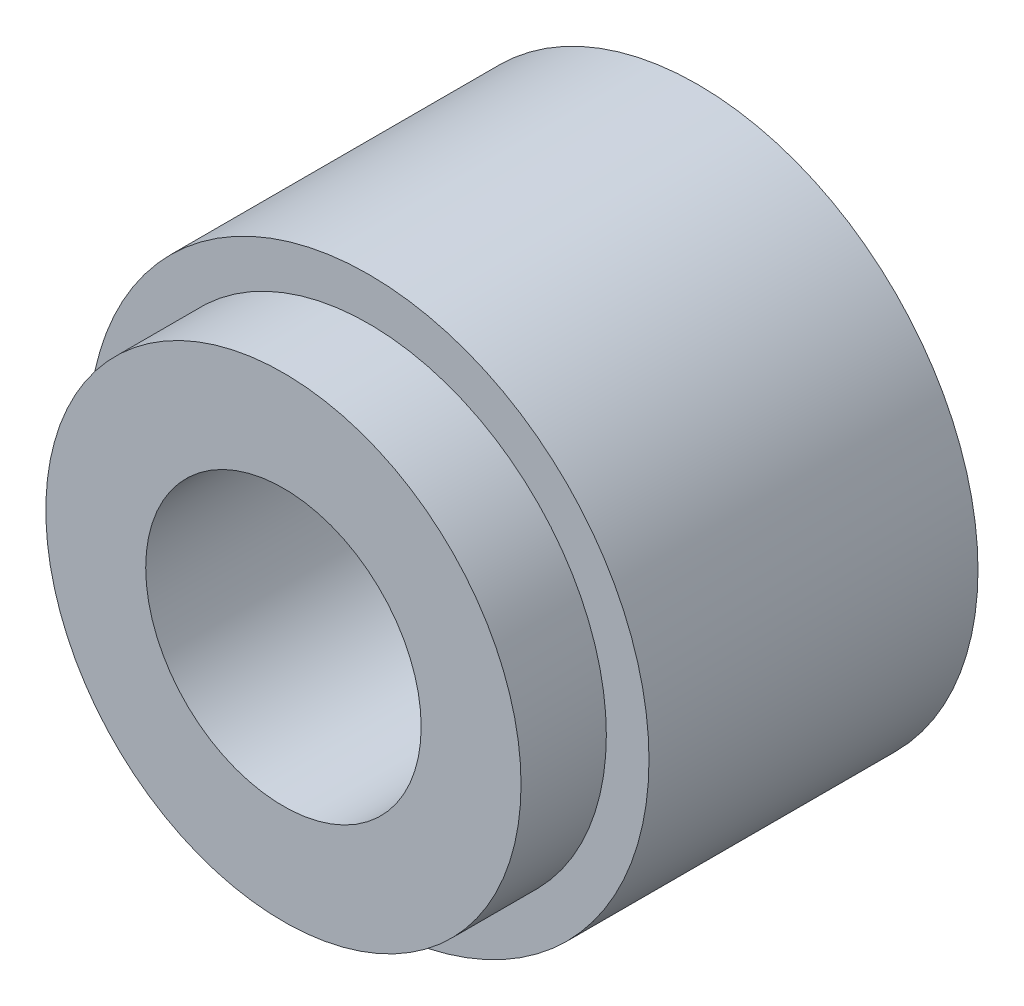
ISO-10303-21;
HEADER;
FILE_DESCRIPTION(('STEP AP214'),'2;1');
FILE_NAME('part.step','',(''),(''),'','','');
FILE_SCHEMA(('AUTOMOTIVE_DESIGN { 1 0 10303 214 1 1 1 1 }'));
ENDSEC;
DATA;
#1=APPLICATION_CONTEXT('core data for automotive mechanical design processes');
#2=APPLICATION_PROTOCOL_DEFINITION('international standard','automotive_design',2000,#1);
#3=PRODUCT_CONTEXT('',#1,'mechanical');
#4=PRODUCT('Part','Part','',(#3));
#5=PRODUCT_RELATED_PRODUCT_CATEGORY('part','',(#4));
#6=PRODUCT_DEFINITION_FORMATION('','',#4);
#7=PRODUCT_DEFINITION_CONTEXT('part definition',#1,'design');
#8=PRODUCT_DEFINITION('design','',#6,#7);
#9=PRODUCT_DEFINITION_SHAPE('','',#8);
#10=(LENGTH_UNIT() NAMED_UNIT(*) SI_UNIT(.MILLI.,.METRE.));
#11=(NAMED_UNIT(*) PLANE_ANGLE_UNIT() SI_UNIT($,.RADIAN.));
#12=(NAMED_UNIT(*) SI_UNIT($,.STERADIAN.) SOLID_ANGLE_UNIT());
#13=UNCERTAINTY_MEASURE_WITH_UNIT(LENGTH_MEASURE(1.E-05),#10,'distance_accuracy_value','');
#14=(GEOMETRIC_REPRESENTATION_CONTEXT(3) GLOBAL_UNCERTAINTY_ASSIGNED_CONTEXT((#13)) GLOBAL_UNIT_ASSIGNED_CONTEXT((#10,
#11,#12)) REPRESENTATION_CONTEXT('',''));
#15=CARTESIAN_POINT('',(0.,0.,0.));
#16=DIRECTION('',(0.,0.,1.));
#17=DIRECTION('',(1.,0.,0.));
#18=AXIS2_PLACEMENT_3D('',#15,#16,#17);
#19=CARTESIAN_POINT('',(0.,0.,2.7));
#20=DIRECTION('',(0.,0.,1.));
#21=DIRECTION('',(1.,0.,0.));
#22=AXIS2_PLACEMENT_3D('',#19,#20,#21);
#23=PLANE('',#22);
#24=CARTESIAN_POINT('',(0.,0.,2.7));
#25=DIRECTION('',(0.,0.,1.));
#26=DIRECTION('',(1.,0.,0.));
#27=AXIS2_PLACEMENT_3D('',#24,#25,#26);
#28=CIRCLE('',#27,2.3);
#29=CARTESIAN_POINT('',(-2.3,0.,2.7));
#30=VERTEX_POINT('',#29);
#31=EDGE_CURVE('E10',#30,#30,#28,.T.);
#32=ORIENTED_EDGE('',*,*,#31,.T.);
#33=EDGE_LOOP('',(#32));
#34=FACE_BOUND('',#33,.T.);
#35=CARTESIAN_POINT('',(0.,0.,2.7));
#36=DIRECTION('',(0.,0.,1.));
#37=DIRECTION('',(1.,0.,0.));
#38=AXIS2_PLACEMENT_3D('',#35,#36,#37);
#39=CIRCLE('',#38,1.95);
#40=CARTESIAN_POINT('',(1.95,0.,2.7));
#41=VERTEX_POINT('',#40);
#42=EDGE_CURVE('E45',#41,#41,#39,.T.);
#43=ORIENTED_EDGE('',*,*,#42,.F.);
#44=EDGE_LOOP('',(#43));
#45=FACE_BOUND('',#44,.T.);
#46=ADVANCED_FACE('F32',(#34,#45),#23,.T.);
#47=CARTESIAN_POINT('',(0.,0.,2.7));
#48=DIRECTION('',(0.,0.,-1.));
#49=DIRECTION('',(-1.,0.,0.));
#50=AXIS2_PLACEMENT_3D('',#47,#48,#49);
#51=CYLINDRICAL_SURFACE('',#50,2.3);
#52=CARTESIAN_POINT('',(0.,0.,0.));
#53=DIRECTION('',(0.,0.,1.));
#54=DIRECTION('',(1.,0.,0.));
#55=AXIS2_PLACEMENT_3D('',#52,#53,#54);
#56=CIRCLE('',#55,2.3);
#57=CARTESIAN_POINT('',(-2.3,0.,0.));
#58=VERTEX_POINT('',#57);
#59=EDGE_CURVE('E36',#58,#58,#56,.T.);
#60=CARTESIAN_POINT('',(-2.3,0.,2.7));
#61=CARTESIAN_POINT('',(-2.3,0.,2.671875));
#62=CARTESIAN_POINT('',(-2.3,0.,2.64375));
#63=CARTESIAN_POINT('',(-2.3,0.,2.5875));
#64=CARTESIAN_POINT('',(-2.3,0.,2.559375));
#65=CARTESIAN_POINT('',(-2.3,0.,2.503125));
#66=CARTESIAN_POINT('',(-2.3,0.,2.475));
#67=CARTESIAN_POINT('',(-2.3,0.,2.41875));
#68=CARTESIAN_POINT('',(-2.3,0.,2.390625));
#69=CARTESIAN_POINT('',(-2.3,0.,2.334375));
#70=CARTESIAN_POINT('',(-2.3,0.,2.30625));
#71=CARTESIAN_POINT('',(-2.3,0.,2.25));
#72=CARTESIAN_POINT('',(-2.3,0.,2.221875));
#73=CARTESIAN_POINT('',(-2.3,0.,2.165625));
#74=CARTESIAN_POINT('',(-2.3,0.,2.1375));
#75=CARTESIAN_POINT('',(-2.3,0.,2.08125));
#76=CARTESIAN_POINT('',(-2.3,0.,2.053125));
#77=CARTESIAN_POINT('',(-2.3,0.,1.996875));
#78=CARTESIAN_POINT('',(-2.3,0.,1.96875));
#79=CARTESIAN_POINT('',(-2.3,0.,1.9125));
#80=CARTESIAN_POINT('',(-2.3,0.,1.884375));
#81=CARTESIAN_POINT('',(-2.3,0.,1.828125));
#82=CARTESIAN_POINT('',(-2.3,0.,1.8));
#83=CARTESIAN_POINT('',(-2.3,0.,1.74375));
#84=CARTESIAN_POINT('',(-2.3,0.,1.715625));
#85=CARTESIAN_POINT('',(-2.3,0.,1.659375));
#86=CARTESIAN_POINT('',(-2.3,0.,1.63125));
#87=CARTESIAN_POINT('',(-2.3,0.,1.575));
#88=CARTESIAN_POINT('',(-2.3,0.,1.546875));
#89=CARTESIAN_POINT('',(-2.3,0.,1.490625));
#90=CARTESIAN_POINT('',(-2.3,0.,1.4625));
#91=CARTESIAN_POINT('',(-2.3,0.,1.40625));
#92=CARTESIAN_POINT('',(-2.3,0.,1.378125));
#93=CARTESIAN_POINT('',(-2.3,0.,1.321875));
#94=CARTESIAN_POINT('',(-2.3,0.,1.29375));
#95=CARTESIAN_POINT('',(-2.3,0.,1.2375));
#96=CARTESIAN_POINT('',(-2.3,0.,1.209375));
#97=CARTESIAN_POINT('',(-2.3,0.,1.153125));
#98=CARTESIAN_POINT('',(-2.3,0.,1.125));
#99=CARTESIAN_POINT('',(-2.3,0.,1.06875));
#100=CARTESIAN_POINT('',(-2.3,0.,1.040625));
#101=CARTESIAN_POINT('',(-2.3,0.,0.984375));
#102=CARTESIAN_POINT('',(-2.3,0.,0.95625));
#103=CARTESIAN_POINT('',(-2.3,0.,0.9));
#104=CARTESIAN_POINT('',(-2.3,0.,0.871875));
#105=CARTESIAN_POINT('',(-2.3,0.,0.815625));
#106=CARTESIAN_POINT('',(-2.3,0.,0.7875));
#107=CARTESIAN_POINT('',(-2.3,0.,0.73125));
#108=CARTESIAN_POINT('',(-2.3,0.,0.703125));
#109=CARTESIAN_POINT('',(-2.3,0.,0.646875));
#110=CARTESIAN_POINT('',(-2.3,0.,0.61875));
#111=CARTESIAN_POINT('',(-2.3,0.,0.5625));
#112=CARTESIAN_POINT('',(-2.3,0.,0.534375));
#113=CARTESIAN_POINT('',(-2.3,0.,0.478125));
#114=CARTESIAN_POINT('',(-2.3,0.,0.45));
#115=CARTESIAN_POINT('',(-2.3,0.,0.39375));
#116=CARTESIAN_POINT('',(-2.3,0.,0.365625));
#117=CARTESIAN_POINT('',(-2.3,0.,0.309375));
#118=CARTESIAN_POINT('',(-2.3,0.,0.28125));
#119=CARTESIAN_POINT('',(-2.3,0.,0.225));
#120=CARTESIAN_POINT('',(-2.3,0.,0.196875));
#121=CARTESIAN_POINT('',(-2.3,0.,0.140625));
#122=CARTESIAN_POINT('',(-2.3,0.,0.112499999999999));
#123=CARTESIAN_POINT('',(-2.3,0.,0.0562499999999994));
#124=CARTESIAN_POINT('',(-2.3,0.,0.0281249999999995));
#125=CARTESIAN_POINT('',(-2.3,0.,0.));
#126=B_SPLINE_CURVE_WITH_KNOTS('',3,(#60,#61,#62,#63,#64,#65,#66,#67,#68,#69,#70,#71,#72,#73,
#74,#75,#76,#77,#78,#79,#80,#81,#82,#83,#84,#85,#86,#87,#88,#89,#90,#91,#92,#93,#94,#95,#96,#97,
#98,#99,#100,#101,#102,#103,#104,#105,#106,#107,#108,#109,#110,#111,#112,#113,#114,#115,#116,
#117,#118,#119,#120,#121,#122,#123,#124,#125),.UNSPECIFIED.,.F.,.F.,(4,2,2,2,2,2,2,2,2,2,2,2,2,
2,2,2,2,2,2,2,2,2,2,2,2,2,2,2,2,2,2,2,4),(0.,0.0843749999999998,0.16875,0.253125,0.3375,
0.421875,0.50625,0.590625,0.675,0.759375,0.84375,0.928125,1.0125,1.096875,1.18125,1.265625,1.35,
1.434375,1.51875,1.603125,1.6875,1.771875,1.85625,1.940625,2.025,2.109375,2.19375,2.278125,
2.3625,2.446875,2.53125,2.615625,2.7),.UNSPECIFIED.);
#127=EDGE_CURVE('BSEAM34',#30,#58,#126,.T.);
#128=ORIENTED_EDGE('',*,*,#31,.F.);
#129=ORIENTED_EDGE('',*,*,#59,.T.);
#130=ORIENTED_EDGE('',*,*,#127,.T.);
#131=ORIENTED_EDGE('',*,*,#127,.F.);
#132=EDGE_LOOP('',(#128,#130,#129,#131));
#133=FACE_BOUND('',#132,.T.);
#134=ADVANCED_FACE('F34',(#133),#51,.T.);
#135=CARTESIAN_POINT('',(0.,0.,0.));
#136=DIRECTION('',(0.,0.,1.));
#137=DIRECTION('',(1.,0.,0.));
#138=AXIS2_PLACEMENT_3D('',#135,#136,#137);
#139=PLANE('',#138);
#140=CARTESIAN_POINT('',(0.,0.,0.));
#141=DIRECTION('',(0.,0.,1.));
#142=DIRECTION('',(1.,0.,0.));
#143=AXIS2_PLACEMENT_3D('',#140,#141,#142);
#144=CIRCLE('',#143,1.27);
#145=CARTESIAN_POINT('',(1.27,0.,0.));
#146=VERTEX_POINT('',#145);
#147=EDGE_CURVE('E48',#146,#146,#144,.T.);
#148=ORIENTED_EDGE('',*,*,#147,.T.);
#149=EDGE_LOOP('',(#148));
#150=FACE_BOUND('',#149,.T.);
#151=ORIENTED_EDGE('',*,*,#59,.F.);
#152=EDGE_LOOP('',(#151));
#153=FACE_BOUND('',#152,.T.);
#154=ADVANCED_FACE('F72',(#150,#153),#139,.F.);
#155=CARTESIAN_POINT('',(0.,0.,3.4));
#156=DIRECTION('',(0.,0.,-1.));
#157=DIRECTION('',(-1.,0.,0.));
#158=AXIS2_PLACEMENT_3D('',#155,#156,#157);
#159=CYLINDRICAL_SURFACE('',#158,1.95);
#160=CARTESIAN_POINT('',(0.,0.,3.4));
#161=DIRECTION('',(0.,0.,1.));
#162=DIRECTION('',(1.,0.,0.));
#163=AXIS2_PLACEMENT_3D('',#160,#161,#162);
#164=CIRCLE('',#163,1.95);
#165=CARTESIAN_POINT('',(1.95,0.,3.4));
#166=VERTEX_POINT('',#165);
#167=EDGE_CURVE('E43',#166,#166,#164,.T.);
#168=ORIENTED_EDGE('',*,*,#167,.F.);
#169=EDGE_LOOP('',(#168));
#170=FACE_BOUND('',#169,.T.);
#171=ORIENTED_EDGE('',*,*,#42,.T.);
#172=EDGE_LOOP('',(#171));
#173=FACE_BOUND('',#172,.T.);
#174=ADVANCED_FACE('F66',(#170,#173),#159,.T.);
#175=CARTESIAN_POINT('',(0.,0.,3.4));
#176=DIRECTION('',(0.,0.,1.));
#177=DIRECTION('',(1.,0.,0.));
#178=AXIS2_PLACEMENT_3D('',#175,#176,#177);
#179=PLANE('',#178);
#180=CARTESIAN_POINT('',(0.,0.,3.4));
#181=DIRECTION('',(0.,0.,1.));
#182=DIRECTION('',(1.,0.,0.));
#183=AXIS2_PLACEMENT_3D('',#180,#181,#182);
#184=CIRCLE('',#183,1.1303);
#185=CARTESIAN_POINT('',(1.1303,0.,3.4));
#186=VERTEX_POINT('',#185);
#187=EDGE_CURVE('E56',#186,#186,#184,.T.);
#188=ORIENTED_EDGE('',*,*,#187,.F.);
#189=EDGE_LOOP('',(#188));
#190=FACE_BOUND('',#189,.T.);
#191=ORIENTED_EDGE('',*,*,#167,.T.);
#192=EDGE_LOOP('',(#191));
#193=FACE_BOUND('',#192,.T.);
#194=ADVANCED_FACE('F62',(#190,#193),#179,.T.);
#195=CARTESIAN_POINT('',(0.,0.,0.1397));
#196=DIRECTION('',(0.,0.,-1.));
#197=DIRECTION('',(-1.,0.,0.));
#198=AXIS2_PLACEMENT_3D('',#195,#196,#197);
#199=CONICAL_SURFACE('',#198,1.1303,0.785398163397447);
#200=ORIENTED_EDGE('',*,*,#147,.F.);
#201=EDGE_LOOP('',(#200));
#202=FACE_BOUND('',#201,.T.);
#203=CARTESIAN_POINT('',(0.,0.,0.1397));
#204=DIRECTION('',(0.,0.,1.));
#205=DIRECTION('',(1.,0.,0.));
#206=AXIS2_PLACEMENT_3D('',#203,#204,#205);
#207=CIRCLE('',#206,1.1303);
#208=CARTESIAN_POINT('',(1.1303,0.,0.1397));
#209=VERTEX_POINT('',#208);
#210=EDGE_CURVE('E53',#209,#209,#207,.T.);
#211=ORIENTED_EDGE('',*,*,#210,.T.);
#212=EDGE_LOOP('',(#211));
#213=FACE_BOUND('',#212,.T.);
#214=ADVANCED_FACE('F65',(#202,#213),#199,.F.);
#215=CARTESIAN_POINT('',(0.,0.,3.4));
#216=DIRECTION('',(0.,0.,1.));
#217=DIRECTION('',(1.,0.,0.));
#218=AXIS2_PLACEMENT_3D('',#215,#216,#217);
#219=CYLINDRICAL_SURFACE('',#218,1.1303);
#220=ORIENTED_EDGE('',*,*,#210,.F.);
#221=EDGE_LOOP('',(#220));
#222=FACE_BOUND('',#221,.T.);
#223=ORIENTED_EDGE('',*,*,#187,.T.);
#224=EDGE_LOOP('',(#223));
#225=FACE_BOUND('',#224,.T.);
#226=ADVANCED_FACE('F60',(#222,#225),#219,.F.);
#227=CLOSED_SHELL('',(#46,#134,#154,#174,#194,#214,#226));
#228=MANIFOLD_SOLID_BREP('B2',#227);
#229=ADVANCED_BREP_SHAPE_REPRESENTATION('',(#18,#228),#14);
#230=SHAPE_DEFINITION_REPRESENTATION(#9,#229);
ENDSEC;
END-ISO-10303-21;
